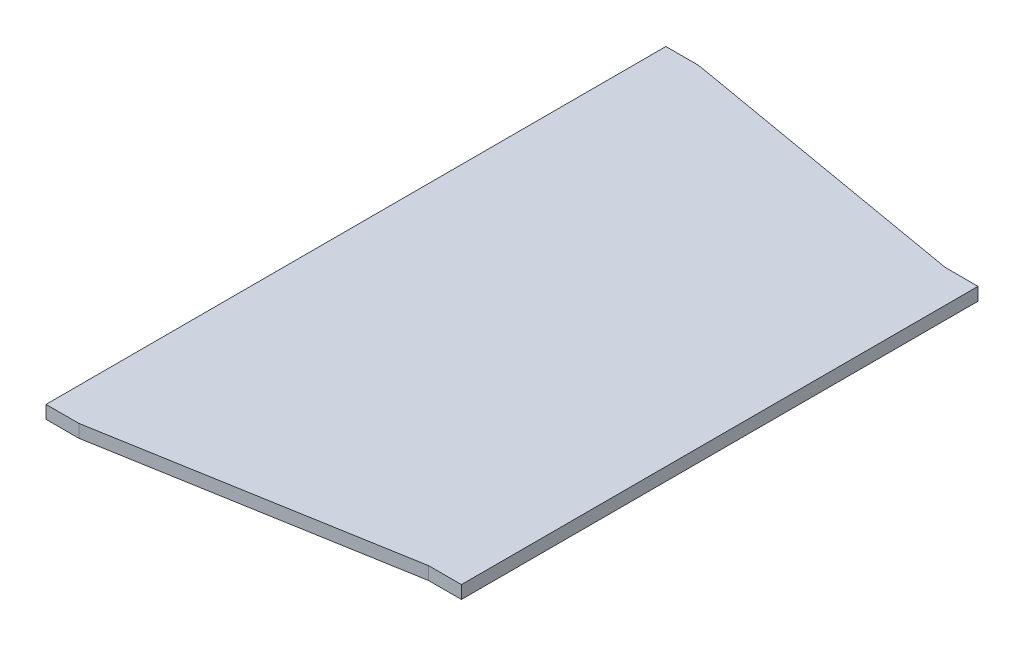
ISO-10303-21;
HEADER;
FILE_DESCRIPTION(('STEP AP214'),'2;1');
FILE_NAME('part.step','',(''),(''),'','','');
FILE_SCHEMA(('AUTOMOTIVE_DESIGN { 1 0 10303 214 1 1 1 1 }'));
ENDSEC;
DATA;
#1=APPLICATION_CONTEXT('core data for automotive mechanical design processes');
#2=APPLICATION_PROTOCOL_DEFINITION('international standard','automotive_design',2000,#1);
#3=PRODUCT_CONTEXT('',#1,'mechanical');
#4=PRODUCT('Part','Part','',(#3));
#5=PRODUCT_RELATED_PRODUCT_CATEGORY('part','',(#4));
#6=PRODUCT_DEFINITION_FORMATION('','',#4);
#7=PRODUCT_DEFINITION_CONTEXT('part definition',#1,'design');
#8=PRODUCT_DEFINITION('design','',#6,#7);
#9=PRODUCT_DEFINITION_SHAPE('','',#8);
#10=(LENGTH_UNIT() NAMED_UNIT(*) SI_UNIT(.MILLI.,.METRE.));
#11=(NAMED_UNIT(*) PLANE_ANGLE_UNIT() SI_UNIT($,.RADIAN.));
#12=(NAMED_UNIT(*) SI_UNIT($,.STERADIAN.) SOLID_ANGLE_UNIT());
#13=UNCERTAINTY_MEASURE_WITH_UNIT(LENGTH_MEASURE(1.E-05),#10,'distance_accuracy_value','');
#14=(GEOMETRIC_REPRESENTATION_CONTEXT(3) GLOBAL_UNCERTAINTY_ASSIGNED_CONTEXT((#13)) GLOBAL_UNIT_ASSIGNED_CONTEXT((#10,
#11,#12)) REPRESENTATION_CONTEXT('',''));
#15=CARTESIAN_POINT('',(0.,0.,0.));
#16=DIRECTION('',(0.,0.,1.));
#17=DIRECTION('',(1.,0.,0.));
#18=AXIS2_PLACEMENT_3D('',#15,#16,#17);
#19=CARTESIAN_POINT('',(256.27,10.,-200.));
#20=DIRECTION('',(-1.,0.,0.));
#21=DIRECTION('',(0.,0.,1.));
#22=AXIS2_PLACEMENT_3D('',#19,#20,#21);
#23=PLANE('',#22);
#24=DIRECTION('',(0.,0.,-1.));
#25=VECTOR('',#24,1.);
#26=CARTESIAN_POINT('',(256.27,0.,-200.));
#27=LINE('',#26,#25);
#28=CARTESIAN_POINT('',(256.27,0.,200.));
#29=VERTEX_POINT('',#28);
#30=CARTESIAN_POINT('',(256.27,0.,-200.));
#31=VERTEX_POINT('',#30);
#32=EDGE_CURVE('E134',#29,#31,#27,.T.);
#33=ORIENTED_EDGE('',*,*,#32,.T.);
#34=DIRECTION('',(0.,-1.,0.));
#35=VECTOR('',#34,1.);
#36=CARTESIAN_POINT('',(256.27,10.,-200.));
#37=LINE('',#36,#35);
#38=CARTESIAN_POINT('',(256.27,10.,-200.));
#39=VERTEX_POINT('',#38);
#40=EDGE_CURVE('E11',#39,#31,#37,.T.);
#41=ORIENTED_EDGE('',*,*,#40,.F.);
#42=DIRECTION('',(0.,0.,-1.));
#43=VECTOR('',#42,1.);
#44=CARTESIAN_POINT('',(256.27,10.,-200.));
#45=LINE('',#44,#43);
#46=CARTESIAN_POINT('',(256.27,10.,200.));
#47=VERTEX_POINT('',#46);
#48=EDGE_CURVE('E158',#47,#39,#45,.T.);
#49=ORIENTED_EDGE('',*,*,#48,.F.);
#50=DIRECTION('',(0.,-1.,0.));
#51=VECTOR('',#50,1.);
#52=CARTESIAN_POINT('',(256.27,10.,200.));
#53=LINE('',#52,#51);
#54=EDGE_CURVE('E125',#47,#29,#53,.T.);
#55=ORIENTED_EDGE('',*,*,#54,.T.);
#56=EDGE_LOOP('',(#33,#41,#49,#55));
#57=FACE_BOUND('',#56,.T.);
#58=ADVANCED_FACE('F33',(#57),#23,.F.);
#59=CARTESIAN_POINT('',(230.87,10.,-200.));
#60=DIRECTION('',(0.,0.,1.));
#61=DIRECTION('',(1.,0.,0.));
#62=AXIS2_PLACEMENT_3D('',#59,#60,#61);
#63=PLANE('',#62);
#64=DIRECTION('',(-1.,0.,0.));
#65=VECTOR('',#64,1.);
#66=CARTESIAN_POINT('',(230.87,0.,-200.));
#67=LINE('',#66,#65);
#68=CARTESIAN_POINT('',(230.87,0.,-200.));
#69=VERTEX_POINT('',#68);
#70=EDGE_CURVE('E137',#31,#69,#67,.T.);
#71=ORIENTED_EDGE('',*,*,#70,.T.);
#72=DIRECTION('',(0.,-1.,0.));
#73=VECTOR('',#72,1.);
#74=CARTESIAN_POINT('',(230.87,10.,-200.));
#75=LINE('',#74,#73);
#76=CARTESIAN_POINT('',(230.87,10.,-200.));
#77=VERTEX_POINT('',#76);
#78=EDGE_CURVE('E41',#77,#69,#75,.T.);
#79=ORIENTED_EDGE('',*,*,#78,.F.);
#80=DIRECTION('',(-1.,0.,0.));
#81=VECTOR('',#80,1.);
#82=CARTESIAN_POINT('',(230.87,10.,-200.));
#83=LINE('',#82,#81);
#84=EDGE_CURVE('E92',#39,#77,#83,.T.);
#85=ORIENTED_EDGE('',*,*,#84,.F.);
#86=ORIENTED_EDGE('',*,*,#40,.T.);
#87=EDGE_LOOP('',(#71,#79,#85,#86));
#88=FACE_BOUND('',#87,.T.);
#89=ADVANCED_FACE('F198',(#88),#63,.F.);
#90=CARTESIAN_POINT('',(230.87,10.,-200.));
#91=DIRECTION('',(-0.170714352152315,0.,0.985320562035125));
#92=DIRECTION('',(0.985320562035125,0.,0.170714352152315));
#93=AXIS2_PLACEMENT_3D('',#90,#91,#92);
#94=PLANE('',#93);
#95=CARTESIAN_POINT('',(230.87,0.,-200.));
#96=CARTESIAN_POINT('',(0.,0.,-240.));
#97=B_SPLINE_CURVE_WITH_KNOTS('',1,(#95,#96),.UNSPECIFIED.,.F.,.F.,(2,2),(0.,1.),.UNSPECIFIED.);
#98=CARTESIAN_POINT('',(0.,0.,-240.));
#99=VERTEX_POINT('',#98);
#100=EDGE_CURVE('E139',#69,#99,#97,.T.);
#101=ORIENTED_EDGE('',*,*,#100,.T.);
#102=DIRECTION('',(0.,-1.,0.));
#103=VECTOR('',#102,1.);
#104=CARTESIAN_POINT('',(0.,10.,-240.));
#105=LINE('',#104,#103);
#106=CARTESIAN_POINT('',(0.,10.,-240.));
#107=VERTEX_POINT('',#106);
#108=EDGE_CURVE('E165',#107,#99,#105,.T.);
#109=ORIENTED_EDGE('',*,*,#108,.F.);
#110=CARTESIAN_POINT('',(230.87,10.,-200.));
#111=CARTESIAN_POINT('',(0.,10.,-240.));
#112=B_SPLINE_CURVE_WITH_KNOTS('',1,(#110,#111),.UNSPECIFIED.,.F.,.F.,(2,2),(0.,1.),.UNSPECIFIED.);
#113=EDGE_CURVE('E173',#77,#107,#112,.T.);
#114=ORIENTED_EDGE('',*,*,#113,.F.);
#115=ORIENTED_EDGE('',*,*,#78,.T.);
#116=EDGE_LOOP('',(#101,#109,#114,#115));
#117=FACE_BOUND('',#116,.T.);
#118=ADVANCED_FACE('F171',(#117),#94,.F.);
#119=CARTESIAN_POINT('',(0.,10.,-240.));
#120=DIRECTION('',(0.,0.,1.));
#121=DIRECTION('',(1.,0.,0.));
#122=AXIS2_PLACEMENT_3D('',#119,#120,#121);
#123=PLANE('',#122);
#124=DIRECTION('',(-1.,0.,0.));
#125=VECTOR('',#124,1.);
#126=CARTESIAN_POINT('',(0.,0.,-240.));
#127=LINE('',#126,#125);
#128=CARTESIAN_POINT('',(-25.4,0.,-240.));
#129=VERTEX_POINT('',#128);
#130=EDGE_CURVE('E143',#99,#129,#127,.T.);
#131=ORIENTED_EDGE('',*,*,#130,.T.);
#132=DIRECTION('',(0.,-1.,0.));
#133=VECTOR('',#132,1.);
#134=CARTESIAN_POINT('',(-25.4,10.,-240.));
#135=LINE('',#134,#133);
#136=CARTESIAN_POINT('',(-25.4,10.,-240.));
#137=VERTEX_POINT('',#136);
#138=EDGE_CURVE('E162',#137,#129,#135,.T.);
#139=ORIENTED_EDGE('',*,*,#138,.F.);
#140=DIRECTION('',(-1.,0.,0.));
#141=VECTOR('',#140,1.);
#142=CARTESIAN_POINT('',(0.,10.,-240.));
#143=LINE('',#142,#141);
#144=EDGE_CURVE('E185',#107,#137,#143,.T.);
#145=ORIENTED_EDGE('',*,*,#144,.F.);
#146=ORIENTED_EDGE('',*,*,#108,.T.);
#147=EDGE_LOOP('',(#131,#139,#145,#146));
#148=FACE_BOUND('',#147,.T.);
#149=ADVANCED_FACE('F181',(#148),#123,.F.);
#150=CARTESIAN_POINT('',(-25.4,10.,-240.));
#151=DIRECTION('',(1.,0.,0.));
#152=DIRECTION('',(0.,0.,-1.));
#153=AXIS2_PLACEMENT_3D('',#150,#151,#152);
#154=PLANE('',#153);
#155=DIRECTION('',(0.,0.,1.));
#156=VECTOR('',#155,1.);
#157=CARTESIAN_POINT('',(-25.4,0.,-240.));
#158=LINE('',#157,#156);
#159=CARTESIAN_POINT('',(-25.3999999999999,0.,240.));
#160=VERTEX_POINT('',#159);
#161=EDGE_CURVE('E148',#129,#160,#158,.T.);
#162=ORIENTED_EDGE('',*,*,#161,.T.);
#163=DIRECTION('',(0.,-1.,0.));
#164=VECTOR('',#163,1.);
#165=CARTESIAN_POINT('',(-25.3999999999999,10.,240.));
#166=LINE('',#165,#164);
#167=CARTESIAN_POINT('',(-25.3999999999999,10.,240.));
#168=VERTEX_POINT('',#167);
#169=EDGE_CURVE('E120',#168,#160,#166,.T.);
#170=ORIENTED_EDGE('',*,*,#169,.F.);
#171=DIRECTION('',(0.,0.,1.));
#172=VECTOR('',#171,1.);
#173=CARTESIAN_POINT('',(-25.4,10.,-240.));
#174=LINE('',#173,#172);
#175=EDGE_CURVE('E111',#137,#168,#174,.T.);
#176=ORIENTED_EDGE('',*,*,#175,.F.);
#177=ORIENTED_EDGE('',*,*,#138,.T.);
#178=EDGE_LOOP('',(#162,#170,#176,#177));
#179=FACE_BOUND('',#178,.T.);
#180=ADVANCED_FACE('F184',(#179),#154,.F.);
#181=CARTESIAN_POINT('',(0.,10.,240.));
#182=DIRECTION('',(0.,0.,-1.));
#183=DIRECTION('',(-1.,0.,0.));
#184=AXIS2_PLACEMENT_3D('',#181,#182,#183);
#185=PLANE('',#184);
#186=DIRECTION('',(1.,0.,0.));
#187=VECTOR('',#186,1.);
#188=CARTESIAN_POINT('',(0.,0.,240.));
#189=LINE('',#188,#187);
#190=CARTESIAN_POINT('',(0.,0.,240.));
#191=VERTEX_POINT('',#190);
#192=EDGE_CURVE('E119',#160,#191,#189,.T.);
#193=ORIENTED_EDGE('',*,*,#192,.T.);
#194=DIRECTION('',(0.,-1.,0.));
#195=VECTOR('',#194,1.);
#196=CARTESIAN_POINT('',(0.,10.,240.));
#197=LINE('',#196,#195);
#198=CARTESIAN_POINT('',(0.,10.,240.));
#199=VERTEX_POINT('',#198);
#200=EDGE_CURVE('E116',#199,#191,#197,.T.);
#201=ORIENTED_EDGE('',*,*,#200,.F.);
#202=DIRECTION('',(1.,0.,0.));
#203=VECTOR('',#202,1.);
#204=CARTESIAN_POINT('',(0.,10.,240.));
#205=LINE('',#204,#203);
#206=EDGE_CURVE('E105',#168,#199,#205,.T.);
#207=ORIENTED_EDGE('',*,*,#206,.F.);
#208=ORIENTED_EDGE('',*,*,#169,.T.);
#209=EDGE_LOOP('',(#193,#201,#207,#208));
#210=FACE_BOUND('',#209,.T.);
#211=ADVANCED_FACE('F117',(#210),#185,.F.);
#212=CARTESIAN_POINT('',(0.,10.,240.));
#213=DIRECTION('',(-0.170714352152315,0.,-0.985320562035125));
#214=DIRECTION('',(-0.985320562035125,0.,0.170714352152315));
#215=AXIS2_PLACEMENT_3D('',#212,#213,#214);
#216=PLANE('',#215);
#217=CARTESIAN_POINT('',(0.,0.,240.));
#218=CARTESIAN_POINT('',(230.87,0.,200.));
#219=B_SPLINE_CURVE_WITH_KNOTS('',1,(#217,#218),.UNSPECIFIED.,.F.,.F.,(2,2),(0.,1.),.UNSPECIFIED.);
#220=CARTESIAN_POINT('',(230.87,0.,200.));
#221=VERTEX_POINT('',#220);
#222=EDGE_CURVE('E78',#191,#221,#219,.T.);
#223=ORIENTED_EDGE('',*,*,#222,.T.);
#224=DIRECTION('',(0.,-1.,0.));
#225=VECTOR('',#224,1.);
#226=CARTESIAN_POINT('',(230.87,10.,200.));
#227=LINE('',#226,#225);
#228=CARTESIAN_POINT('',(230.87,10.,200.));
#229=VERTEX_POINT('',#228);
#230=EDGE_CURVE('E121',#229,#221,#227,.T.);
#231=ORIENTED_EDGE('',*,*,#230,.F.);
#232=CARTESIAN_POINT('',(0.,10.,240.));
#233=CARTESIAN_POINT('',(230.87,10.,200.));
#234=B_SPLINE_CURVE_WITH_KNOTS('',1,(#232,#233),.UNSPECIFIED.,.F.,.F.,(2,2),(0.,1.),.UNSPECIFIED.);
#235=EDGE_CURVE('E109',#199,#229,#234,.T.);
#236=ORIENTED_EDGE('',*,*,#235,.F.);
#237=ORIENTED_EDGE('',*,*,#200,.T.);
#238=EDGE_LOOP('',(#223,#231,#236,#237));
#239=FACE_BOUND('',#238,.T.);
#240=ADVANCED_FACE('F123',(#239),#216,.F.);
#241=CARTESIAN_POINT('',(230.87,10.,200.));
#242=DIRECTION('',(0.,0.,-1.));
#243=DIRECTION('',(-1.,0.,0.));
#244=AXIS2_PLACEMENT_3D('',#241,#242,#243);
#245=PLANE('',#244);
#246=DIRECTION('',(1.,0.,0.));
#247=VECTOR('',#246,1.);
#248=CARTESIAN_POINT('',(230.87,0.,200.));
#249=LINE('',#248,#247);
#250=EDGE_CURVE('E84',#221,#29,#249,.T.);
#251=ORIENTED_EDGE('',*,*,#250,.T.);
#252=ORIENTED_EDGE('',*,*,#54,.F.);
#253=DIRECTION('',(1.,0.,0.));
#254=VECTOR('',#253,1.);
#255=CARTESIAN_POINT('',(230.87,10.,200.));
#256=LINE('',#255,#254);
#257=EDGE_CURVE('E49',#229,#47,#256,.T.);
#258=ORIENTED_EDGE('',*,*,#257,.F.);
#259=ORIENTED_EDGE('',*,*,#230,.T.);
#260=EDGE_LOOP('',(#251,#252,#258,#259));
#261=FACE_BOUND('',#260,.T.);
#262=ADVANCED_FACE('F214',(#261),#245,.F.);
#263=CARTESIAN_POINT('',(256.27,10.,-200.));
#264=DIRECTION('',(0.,-1.,0.));
#265=DIRECTION('',(0.,0.,-1.));
#266=AXIS2_PLACEMENT_3D('',#263,#264,#265);
#267=PLANE('',#266);
#268=ORIENTED_EDGE('',*,*,#48,.T.);
#269=ORIENTED_EDGE('',*,*,#84,.T.);
#270=ORIENTED_EDGE('',*,*,#113,.T.);
#271=ORIENTED_EDGE('',*,*,#144,.T.);
#272=ORIENTED_EDGE('',*,*,#175,.T.);
#273=ORIENTED_EDGE('',*,*,#206,.T.);
#274=ORIENTED_EDGE('',*,*,#235,.T.);
#275=ORIENTED_EDGE('',*,*,#257,.T.);
#276=EDGE_LOOP('',(#268,#269,#270,#271,#272,#273,#274,#275));
#277=FACE_BOUND('',#276,.T.);
#278=ADVANCED_FACE('F107',(#277),#267,.F.);
#279=CARTESIAN_POINT('',(256.27,0.,-200.));
#280=DIRECTION('',(0.,-1.,0.));
#281=DIRECTION('',(0.,0.,-1.));
#282=AXIS2_PLACEMENT_3D('',#279,#280,#281);
#283=PLANE('',#282);
#284=ORIENTED_EDGE('',*,*,#32,.F.);
#285=ORIENTED_EDGE('',*,*,#250,.F.);
#286=ORIENTED_EDGE('',*,*,#222,.F.);
#287=ORIENTED_EDGE('',*,*,#192,.F.);
#288=ORIENTED_EDGE('',*,*,#161,.F.);
#289=ORIENTED_EDGE('',*,*,#130,.F.);
#290=ORIENTED_EDGE('',*,*,#100,.F.);
#291=ORIENTED_EDGE('',*,*,#70,.F.);
#292=EDGE_LOOP('',(#284,#285,#286,#287,#288,#289,#290,#291));
#293=FACE_BOUND('',#292,.T.);
#294=ADVANCED_FACE('F177',(#293),#283,.T.);
#295=CLOSED_SHELL('',(#58,#89,#118,#149,#180,#211,#240,#262,#278,#294));
#296=MANIFOLD_SOLID_BREP('B2',#295);
#297=ADVANCED_BREP_SHAPE_REPRESENTATION('',(#18,#296),#14);
#298=SHAPE_DEFINITION_REPRESENTATION(#9,#297);
ENDSEC;
END-ISO-10303-21;
